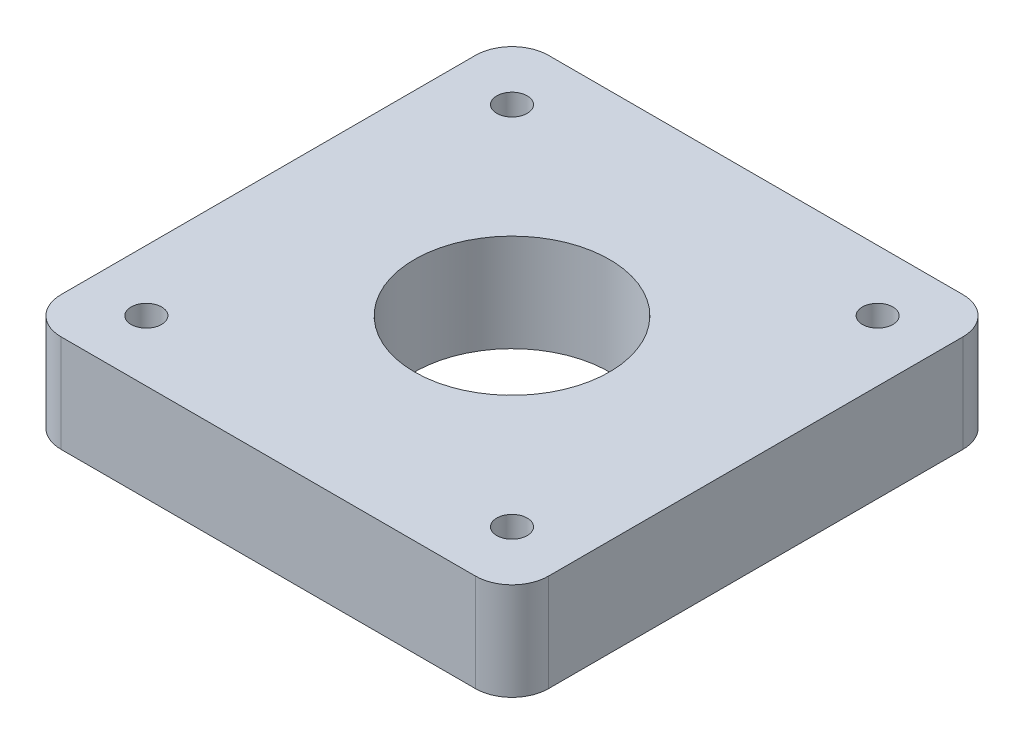
ISO-10303-21;
HEADER;
FILE_DESCRIPTION(('STEP AP214'),'2;1');
FILE_NAME('part.step','',(''),(''),'','','');
FILE_SCHEMA(('AUTOMOTIVE_DESIGN { 1 0 10303 214 1 1 1 1 }'));
ENDSEC;
DATA;
#1=APPLICATION_CONTEXT('core data for automotive mechanical design processes');
#2=APPLICATION_PROTOCOL_DEFINITION('international standard','automotive_design',2000,#1);
#3=PRODUCT_CONTEXT('',#1,'mechanical');
#4=PRODUCT('Part','Part','',(#3));
#5=PRODUCT_RELATED_PRODUCT_CATEGORY('part','',(#4));
#6=PRODUCT_DEFINITION_FORMATION('','',#4);
#7=PRODUCT_DEFINITION_CONTEXT('part definition',#1,'design');
#8=PRODUCT_DEFINITION('design','',#6,#7);
#9=PRODUCT_DEFINITION_SHAPE('','',#8);
#10=(LENGTH_UNIT() NAMED_UNIT(*) SI_UNIT(.MILLI.,.METRE.));
#11=(NAMED_UNIT(*) PLANE_ANGLE_UNIT() SI_UNIT($,.RADIAN.));
#12=(NAMED_UNIT(*) SI_UNIT($,.STERADIAN.) SOLID_ANGLE_UNIT());
#13=UNCERTAINTY_MEASURE_WITH_UNIT(LENGTH_MEASURE(1.E-05),#10,'distance_accuracy_value','');
#14=(GEOMETRIC_REPRESENTATION_CONTEXT(3) GLOBAL_UNCERTAINTY_ASSIGNED_CONTEXT((#13)) GLOBAL_UNIT_ASSIGNED_CONTEXT((#10,
#11,#12)) REPRESENTATION_CONTEXT('',''));
#15=CARTESIAN_POINT('',(0.,0.,0.));
#16=DIRECTION('',(0.,0.,1.));
#17=DIRECTION('',(1.,0.,0.));
#18=AXIS2_PLACEMENT_3D('',#15,#16,#17);
#19=CARTESIAN_POINT('',(0.,8.,0.));
#20=DIRECTION('',(0.,1.,0.));
#21=DIRECTION('',(0.,0.,1.));
#22=AXIS2_PLACEMENT_3D('',#19,#20,#21);
#23=PLANE('',#22);
#24=CARTESIAN_POINT('',(5.,8.,34.8885793871866));
#25=DIRECTION('',(0.,1.,0.));
#26=DIRECTION('',(0.,0.,1.));
#27=AXIS2_PLACEMENT_3D('',#24,#25,#26);
#28=CIRCLE('',#27,1.25);
#29=CARTESIAN_POINT('',(5.,8.,36.1385793871866));
#30=VERTEX_POINT('',#29);
#31=EDGE_CURVE('E192',#30,#30,#28,.T.);
#32=ORIENTED_EDGE('',*,*,#31,.F.);
#33=EDGE_LOOP('',(#32));
#34=FACE_BOUND('',#33,.T.);
#35=CARTESIAN_POINT('',(35.,8.,34.8885793871866));
#36=DIRECTION('',(0.,1.,0.));
#37=DIRECTION('',(0.,0.,1.));
#38=AXIS2_PLACEMENT_3D('',#35,#36,#37);
#39=CIRCLE('',#38,1.25);
#40=CARTESIAN_POINT('',(35.,8.,36.1385793871866));
#41=VERTEX_POINT('',#40);
#42=EDGE_CURVE('E198',#41,#41,#39,.T.);
#43=ORIENTED_EDGE('',*,*,#42,.F.);
#44=EDGE_LOOP('',(#43));
#45=FACE_BOUND('',#44,.T.);
#46=CARTESIAN_POINT('',(35.,8.,4.88857938718663));
#47=DIRECTION('',(0.,1.,0.));
#48=DIRECTION('',(0.,0.,1.));
#49=AXIS2_PLACEMENT_3D('',#46,#47,#48);
#50=CIRCLE('',#49,1.25);
#51=CARTESIAN_POINT('',(35.,8.,6.13857938718663));
#52=VERTEX_POINT('',#51);
#53=EDGE_CURVE('E204',#52,#52,#50,.T.);
#54=ORIENTED_EDGE('',*,*,#53,.F.);
#55=EDGE_LOOP('',(#54));
#56=FACE_BOUND('',#55,.T.);
#57=CARTESIAN_POINT('',(5.,8.,4.88857938718664));
#58=DIRECTION('',(0.,1.,0.));
#59=DIRECTION('',(0.,0.,1.));
#60=AXIS2_PLACEMENT_3D('',#57,#58,#59);
#61=CIRCLE('',#60,1.25);
#62=CARTESIAN_POINT('',(5.,8.,6.13857938718664));
#63=VERTEX_POINT('',#62);
#64=EDGE_CURVE('E186',#63,#63,#61,.T.);
#65=ORIENTED_EDGE('',*,*,#64,.F.);
#66=EDGE_LOOP('',(#65));
#67=FACE_BOUND('',#66,.T.);
#68=DIRECTION('',(1.,0.,0.));
#69=VECTOR('',#68,1.);
#70=CARTESIAN_POINT('',(0.,8.,39.8885793871866));
#71=LINE('',#70,#69);
#72=CARTESIAN_POINT('',(3.,8.,39.8885793871866));
#73=VERTEX_POINT('',#72);
#74=CARTESIAN_POINT('',(37.,8.,39.8885793871866));
#75=VERTEX_POINT('',#74);
#76=EDGE_CURVE('E170',#73,#75,#71,.T.);
#77=ORIENTED_EDGE('',*,*,#76,.T.);
#78=CARTESIAN_POINT('',(37.,8.,36.8885793871866));
#79=DIRECTION('',(0.,1.,0.));
#80=DIRECTION('',(0.,0.,1.));
#81=AXIS2_PLACEMENT_3D('',#78,#79,#80);
#82=CIRCLE('',#81,3.);
#83=CARTESIAN_POINT('',(40.,8.,36.8885793871866));
#84=VERTEX_POINT('',#83);
#85=EDGE_CURVE('E151',#75,#84,#82,.T.);
#86=ORIENTED_EDGE('',*,*,#85,.T.);
#87=DIRECTION('',(0.,0.,-1.));
#88=VECTOR('',#87,1.);
#89=CARTESIAN_POINT('',(40.,8.,-0.111420612813364));
#90=LINE('',#89,#88);
#91=CARTESIAN_POINT('',(40.,8.,2.88857938718664));
#92=VERTEX_POINT('',#91);
#93=EDGE_CURVE('E121',#84,#92,#90,.T.);
#94=ORIENTED_EDGE('',*,*,#93,.T.);
#95=CARTESIAN_POINT('',(37.,8.,2.88857938718664));
#96=DIRECTION('',(0.,1.,0.));
#97=DIRECTION('',(0.,0.,1.));
#98=AXIS2_PLACEMENT_3D('',#95,#96,#97);
#99=CIRCLE('',#98,3.);
#100=CARTESIAN_POINT('',(37.,8.,-0.111420612813364));
#101=VERTEX_POINT('',#100);
#102=EDGE_CURVE('E57',#92,#101,#99,.T.);
#103=ORIENTED_EDGE('',*,*,#102,.T.);
#104=DIRECTION('',(-1.,0.,0.));
#105=VECTOR('',#104,1.);
#106=CARTESIAN_POINT('',(0.,8.,-0.111420612813364));
#107=LINE('',#106,#105);
#108=CARTESIAN_POINT('',(3.,8.,-0.111420612813364));
#109=VERTEX_POINT('',#108);
#110=EDGE_CURVE('E137',#101,#109,#107,.T.);
#111=ORIENTED_EDGE('',*,*,#110,.T.);
#112=CARTESIAN_POINT('',(3.,8.,2.88857938718664));
#113=DIRECTION('',(0.,1.,0.));
#114=DIRECTION('',(0.,0.,1.));
#115=AXIS2_PLACEMENT_3D('',#112,#113,#114);
#116=CIRCLE('',#115,3.);
#117=CARTESIAN_POINT('',(0.,8.,2.88857938718664));
#118=VERTEX_POINT('',#117);
#119=EDGE_CURVE('E148',#109,#118,#116,.T.);
#120=ORIENTED_EDGE('',*,*,#119,.T.);
#121=DIRECTION('',(0.,0.,1.));
#122=VECTOR('',#121,1.);
#123=CARTESIAN_POINT('',(0.,8.,-0.111420612813364));
#124=LINE('',#123,#122);
#125=CARTESIAN_POINT('',(0.,8.,36.8885793871866));
#126=VERTEX_POINT('',#125);
#127=EDGE_CURVE('E131',#118,#126,#124,.T.);
#128=ORIENTED_EDGE('',*,*,#127,.T.);
#129=CARTESIAN_POINT('',(3.,8.,36.8885793871866));
#130=DIRECTION('',(0.,1.,0.));
#131=DIRECTION('',(0.,0.,1.));
#132=AXIS2_PLACEMENT_3D('',#129,#130,#131);
#133=CIRCLE('',#132,3.);
#134=EDGE_CURVE('E146',#126,#73,#133,.T.);
#135=ORIENTED_EDGE('',*,*,#134,.T.);
#136=EDGE_LOOP('',(#77,#86,#94,#103,#111,#120,#128,#135));
#137=FACE_BOUND('',#136,.T.);
#138=CARTESIAN_POINT('',(20.,8.,19.8885793871866));
#139=DIRECTION('',(0.,1.,0.));
#140=DIRECTION('',(0.,0.,1.));
#141=AXIS2_PLACEMENT_3D('',#138,#139,#140);
#142=CIRCLE('',#141,8.);
#143=CARTESIAN_POINT('',(20.,8.,27.8885793871866));
#144=VERTEX_POINT('',#143);
#145=EDGE_CURVE('E175',#144,#144,#142,.T.);
#146=ORIENTED_EDGE('',*,*,#145,.F.);
#147=EDGE_LOOP('',(#146));
#148=FACE_BOUND('',#147,.T.);
#149=ADVANCED_FACE('F35',(#34,#45,#56,#67,#137,#148),#23,.T.);
#150=CARTESIAN_POINT('',(0.,0.,0.));
#151=DIRECTION('',(0.,1.,0.));
#152=DIRECTION('',(0.,0.,1.));
#153=AXIS2_PLACEMENT_3D('',#150,#151,#152);
#154=PLANE('',#153);
#155=CARTESIAN_POINT('',(5.,0.,34.8885793871866));
#156=DIRECTION('',(0.,1.,0.));
#157=DIRECTION('',(0.,0.,1.));
#158=AXIS2_PLACEMENT_3D('',#155,#156,#157);
#159=CIRCLE('',#158,1.25);
#160=CARTESIAN_POINT('',(5.,0.,36.1385793871866));
#161=VERTEX_POINT('',#160);
#162=EDGE_CURVE('E195',#161,#161,#159,.T.);
#163=ORIENTED_EDGE('',*,*,#162,.T.);
#164=EDGE_LOOP('',(#163));
#165=FACE_BOUND('',#164,.T.);
#166=CARTESIAN_POINT('',(35.,0.,34.8885793871866));
#167=DIRECTION('',(0.,1.,0.));
#168=DIRECTION('',(0.,0.,1.));
#169=AXIS2_PLACEMENT_3D('',#166,#167,#168);
#170=CIRCLE('',#169,1.25);
#171=CARTESIAN_POINT('',(35.,0.,36.1385793871866));
#172=VERTEX_POINT('',#171);
#173=EDGE_CURVE('E201',#172,#172,#170,.T.);
#174=ORIENTED_EDGE('',*,*,#173,.T.);
#175=EDGE_LOOP('',(#174));
#176=FACE_BOUND('',#175,.T.);
#177=CARTESIAN_POINT('',(35.,0.,4.88857938718663));
#178=DIRECTION('',(0.,1.,0.));
#179=DIRECTION('',(0.,0.,1.));
#180=AXIS2_PLACEMENT_3D('',#177,#178,#179);
#181=CIRCLE('',#180,1.25);
#182=CARTESIAN_POINT('',(35.,0.,6.13857938718663));
#183=VERTEX_POINT('',#182);
#184=EDGE_CURVE('E189',#183,#183,#181,.T.);
#185=ORIENTED_EDGE('',*,*,#184,.T.);
#186=EDGE_LOOP('',(#185));
#187=FACE_BOUND('',#186,.T.);
#188=CARTESIAN_POINT('',(5.,0.,4.88857938718664));
#189=DIRECTION('',(0.,1.,0.));
#190=DIRECTION('',(0.,0.,1.));
#191=AXIS2_PLACEMENT_3D('',#188,#189,#190);
#192=CIRCLE('',#191,1.25);
#193=CARTESIAN_POINT('',(5.,0.,6.13857938718664));
#194=VERTEX_POINT('',#193);
#195=EDGE_CURVE('E184',#194,#194,#192,.T.);
#196=ORIENTED_EDGE('',*,*,#195,.T.);
#197=EDGE_LOOP('',(#196));
#198=FACE_BOUND('',#197,.T.);
#199=DIRECTION('',(0.,0.,-1.));
#200=VECTOR('',#199,1.);
#201=CARTESIAN_POINT('',(40.,0.,-0.111420612813364));
#202=LINE('',#201,#200);
#203=CARTESIAN_POINT('',(40.,0.,36.8885793871866));
#204=VERTEX_POINT('',#203);
#205=CARTESIAN_POINT('',(40.,0.,2.88857938718664));
#206=VERTEX_POINT('',#205);
#207=EDGE_CURVE('E119',#204,#206,#202,.T.);
#208=ORIENTED_EDGE('',*,*,#207,.F.);
#209=CARTESIAN_POINT('',(37.,0.,36.8885793871866));
#210=DIRECTION('',(0.,1.,0.));
#211=DIRECTION('',(0.,0.,1.));
#212=AXIS2_PLACEMENT_3D('',#209,#210,#211);
#213=CIRCLE('',#212,3.);
#214=CARTESIAN_POINT('',(37.,0.,39.8885793871866));
#215=VERTEX_POINT('',#214);
#216=EDGE_CURVE('E102',#204,#215,#213,.F.);
#217=ORIENTED_EDGE('',*,*,#216,.T.);
#218=DIRECTION('',(1.,0.,0.));
#219=VECTOR('',#218,1.);
#220=CARTESIAN_POINT('',(0.,0.,39.8885793871866));
#221=LINE('',#220,#219);
#222=CARTESIAN_POINT('',(3.,0.,39.8885793871866));
#223=VERTEX_POINT('',#222);
#224=EDGE_CURVE('E129',#223,#215,#221,.T.);
#225=ORIENTED_EDGE('',*,*,#224,.F.);
#226=CARTESIAN_POINT('',(3.,0.,36.8885793871866));
#227=DIRECTION('',(0.,1.,0.));
#228=DIRECTION('',(0.,0.,1.));
#229=AXIS2_PLACEMENT_3D('',#226,#227,#228);
#230=CIRCLE('',#229,3.);
#231=CARTESIAN_POINT('',(0.,0.,36.8885793871866));
#232=VERTEX_POINT('',#231);
#233=EDGE_CURVE('E122',#223,#232,#230,.F.);
#234=ORIENTED_EDGE('',*,*,#233,.T.);
#235=DIRECTION('',(0.,0.,1.));
#236=VECTOR('',#235,1.);
#237=CARTESIAN_POINT('',(0.,0.,-0.111420612813364));
#238=LINE('',#237,#236);
#239=CARTESIAN_POINT('',(0.,0.,2.88857938718664));
#240=VERTEX_POINT('',#239);
#241=EDGE_CURVE('E133',#240,#232,#238,.T.);
#242=ORIENTED_EDGE('',*,*,#241,.F.);
#243=CARTESIAN_POINT('',(3.,0.,2.88857938718664));
#244=DIRECTION('',(0.,1.,0.));
#245=DIRECTION('',(0.,0.,1.));
#246=AXIS2_PLACEMENT_3D('',#243,#244,#245);
#247=CIRCLE('',#246,3.);
#248=CARTESIAN_POINT('',(3.,0.,-0.111420612813364));
#249=VERTEX_POINT('',#248);
#250=EDGE_CURVE('E140',#240,#249,#247,.F.);
#251=ORIENTED_EDGE('',*,*,#250,.T.);
#252=DIRECTION('',(-1.,0.,0.));
#253=VECTOR('',#252,1.);
#254=CARTESIAN_POINT('',(0.,0.,-0.111420612813364));
#255=LINE('',#254,#253);
#256=CARTESIAN_POINT('',(37.,0.,-0.111420612813364));
#257=VERTEX_POINT('',#256);
#258=EDGE_CURVE('E128',#257,#249,#255,.T.);
#259=ORIENTED_EDGE('',*,*,#258,.F.);
#260=CARTESIAN_POINT('',(37.,0.,2.88857938718664));
#261=DIRECTION('',(0.,1.,0.));
#262=DIRECTION('',(0.,0.,1.));
#263=AXIS2_PLACEMENT_3D('',#260,#261,#262);
#264=CIRCLE('',#263,3.);
#265=EDGE_CURVE('E113',#257,#206,#264,.F.);
#266=ORIENTED_EDGE('',*,*,#265,.T.);
#267=EDGE_LOOP('',(#208,#217,#225,#234,#242,#251,#259,#266));
#268=FACE_BOUND('',#267,.T.);
#269=CARTESIAN_POINT('',(20.,0.,19.8885793871866));
#270=DIRECTION('',(0.,1.,0.));
#271=DIRECTION('',(0.,0.,1.));
#272=AXIS2_PLACEMENT_3D('',#269,#270,#271);
#273=CIRCLE('',#272,8.);
#274=CARTESIAN_POINT('',(20.,0.,27.8885793871866));
#275=VERTEX_POINT('',#274);
#276=EDGE_CURVE('E177',#275,#275,#273,.T.);
#277=ORIENTED_EDGE('',*,*,#276,.T.);
#278=EDGE_LOOP('',(#277));
#279=FACE_BOUND('',#278,.T.);
#280=ADVANCED_FACE('F125',(#165,#176,#187,#198,#268,#279),#154,.F.);
#281=CARTESIAN_POINT('',(0.,8.,-0.111420612813364));
#282=DIRECTION('',(1.,0.,0.));
#283=DIRECTION('',(0.,0.,-1.));
#284=AXIS2_PLACEMENT_3D('',#281,#282,#283);
#285=PLANE('',#284);
#286=ORIENTED_EDGE('',*,*,#127,.F.);
#287=DIRECTION('',(0.,-1.,0.));
#288=VECTOR('',#287,1.);
#289=CARTESIAN_POINT('',(0.,8.,2.88857938718664));
#290=LINE('',#289,#288);
#291=EDGE_CURVE('E11',#118,#240,#290,.T.);
#292=ORIENTED_EDGE('',*,*,#291,.T.);
#293=ORIENTED_EDGE('',*,*,#241,.T.);
#294=DIRECTION('',(0.,-1.,0.));
#295=VECTOR('',#294,1.);
#296=CARTESIAN_POINT('',(0.,8.,36.8885793871866));
#297=LINE('',#296,#295);
#298=EDGE_CURVE('E43',#232,#126,#297,.F.);
#299=ORIENTED_EDGE('',*,*,#298,.T.);
#300=EDGE_LOOP('',(#286,#292,#293,#299));
#301=FACE_BOUND('',#300,.T.);
#302=ADVANCED_FACE('F161',(#301),#285,.F.);
#303=CARTESIAN_POINT('',(0.,8.,39.8885793871866));
#304=DIRECTION('',(0.,0.,-1.));
#305=DIRECTION('',(-1.,0.,0.));
#306=AXIS2_PLACEMENT_3D('',#303,#304,#305);
#307=PLANE('',#306);
#308=ORIENTED_EDGE('',*,*,#224,.T.);
#309=DIRECTION('',(0.,-1.,0.));
#310=VECTOR('',#309,1.);
#311=CARTESIAN_POINT('',(37.,8.,39.8885793871866));
#312=LINE('',#311,#310);
#313=EDGE_CURVE('E107',#215,#75,#312,.F.);
#314=ORIENTED_EDGE('',*,*,#313,.T.);
#315=ORIENTED_EDGE('',*,*,#76,.F.);
#316=DIRECTION('',(0.,-1.,0.));
#317=VECTOR('',#316,1.);
#318=CARTESIAN_POINT('',(3.,8.,39.8885793871866));
#319=LINE('',#318,#317);
#320=EDGE_CURVE('E112',#73,#223,#319,.T.);
#321=ORIENTED_EDGE('',*,*,#320,.T.);
#322=EDGE_LOOP('',(#308,#314,#315,#321));
#323=FACE_BOUND('',#322,.T.);
#324=ADVANCED_FACE('F174',(#323),#307,.F.);
#325=CARTESIAN_POINT('',(40.,8.,-0.111420612813364));
#326=DIRECTION('',(-1.,0.,0.));
#327=DIRECTION('',(0.,0.,1.));
#328=AXIS2_PLACEMENT_3D('',#325,#326,#327);
#329=PLANE('',#328);
#330=ORIENTED_EDGE('',*,*,#93,.F.);
#331=DIRECTION('',(0.,-1.,0.));
#332=VECTOR('',#331,1.);
#333=CARTESIAN_POINT('',(40.,8.,36.8885793871866));
#334=LINE('',#333,#332);
#335=EDGE_CURVE('E106',#84,#204,#334,.T.);
#336=ORIENTED_EDGE('',*,*,#335,.T.);
#337=ORIENTED_EDGE('',*,*,#207,.T.);
#338=DIRECTION('',(0.,-1.,0.));
#339=VECTOR('',#338,1.);
#340=CARTESIAN_POINT('',(40.,8.,2.88857938718664));
#341=LINE('',#340,#339);
#342=EDGE_CURVE('E123',#206,#92,#341,.F.);
#343=ORIENTED_EDGE('',*,*,#342,.T.);
#344=EDGE_LOOP('',(#330,#336,#337,#343));
#345=FACE_BOUND('',#344,.T.);
#346=ADVANCED_FACE('F118',(#345),#329,.F.);
#347=CARTESIAN_POINT('',(0.,8.,-0.111420612813364));
#348=DIRECTION('',(0.,0.,1.));
#349=DIRECTION('',(1.,0.,0.));
#350=AXIS2_PLACEMENT_3D('',#347,#348,#349);
#351=PLANE('',#350);
#352=ORIENTED_EDGE('',*,*,#110,.F.);
#353=DIRECTION('',(0.,-1.,0.));
#354=VECTOR('',#353,1.);
#355=CARTESIAN_POINT('',(37.,8.,-0.111420612813364));
#356=LINE('',#355,#354);
#357=EDGE_CURVE('E154',#101,#257,#356,.T.);
#358=ORIENTED_EDGE('',*,*,#357,.T.);
#359=ORIENTED_EDGE('',*,*,#258,.T.);
#360=DIRECTION('',(0.,-1.,0.));
#361=VECTOR('',#360,1.);
#362=CARTESIAN_POINT('',(3.,8.,-0.111420612813364));
#363=LINE('',#362,#361);
#364=EDGE_CURVE('E50',#249,#109,#363,.F.);
#365=ORIENTED_EDGE('',*,*,#364,.T.);
#366=EDGE_LOOP('',(#352,#358,#359,#365));
#367=FACE_BOUND('',#366,.T.);
#368=ADVANCED_FACE('F233',(#367),#351,.F.);
#369=CARTESIAN_POINT('',(20.,8.,19.8885793871866));
#370=DIRECTION('',(0.,-1.,0.));
#371=DIRECTION('',(0.,0.,-1.));
#372=AXIS2_PLACEMENT_3D('',#369,#370,#371);
#373=CYLINDRICAL_SURFACE('',#372,8.);
#374=ORIENTED_EDGE('',*,*,#145,.T.);
#375=EDGE_LOOP('',(#374));
#376=FACE_BOUND('',#375,.T.);
#377=ORIENTED_EDGE('',*,*,#276,.F.);
#378=EDGE_LOOP('',(#377));
#379=FACE_BOUND('',#378,.T.);
#380=ADVANCED_FACE('F227',(#376,#379),#373,.F.);
#381=CARTESIAN_POINT('',(5.,0.,4.88857938718664));
#382=DIRECTION('',(0.,1.,0.));
#383=DIRECTION('',(0.,0.,1.));
#384=AXIS2_PLACEMENT_3D('',#381,#382,#383);
#385=CYLINDRICAL_SURFACE('',#384,1.25);
#386=ORIENTED_EDGE('',*,*,#195,.F.);
#387=EDGE_LOOP('',(#386));
#388=FACE_BOUND('',#387,.T.);
#389=ORIENTED_EDGE('',*,*,#64,.T.);
#390=EDGE_LOOP('',(#389));
#391=FACE_BOUND('',#390,.T.);
#392=ADVANCED_FACE('F216',(#388,#391),#385,.F.);
#393=CARTESIAN_POINT('',(35.,0.,4.88857938718663));
#394=DIRECTION('',(0.,1.,0.));
#395=DIRECTION('',(0.,0.,1.));
#396=AXIS2_PLACEMENT_3D('',#393,#394,#395);
#397=CYLINDRICAL_SURFACE('',#396,1.25);
#398=ORIENTED_EDGE('',*,*,#184,.F.);
#399=EDGE_LOOP('',(#398));
#400=FACE_BOUND('',#399,.T.);
#401=ORIENTED_EDGE('',*,*,#53,.T.);
#402=EDGE_LOOP('',(#401));
#403=FACE_BOUND('',#402,.T.);
#404=ADVANCED_FACE('F212',(#400,#403),#397,.F.);
#405=CARTESIAN_POINT('',(35.,0.,34.8885793871866));
#406=DIRECTION('',(0.,1.,0.));
#407=DIRECTION('',(0.,0.,1.));
#408=AXIS2_PLACEMENT_3D('',#405,#406,#407);
#409=CYLINDRICAL_SURFACE('',#408,1.25);
#410=ORIENTED_EDGE('',*,*,#173,.F.);
#411=EDGE_LOOP('',(#410));
#412=FACE_BOUND('',#411,.T.);
#413=ORIENTED_EDGE('',*,*,#42,.T.);
#414=EDGE_LOOP('',(#413));
#415=FACE_BOUND('',#414,.T.);
#416=ADVANCED_FACE('F215',(#412,#415),#409,.F.);
#417=CARTESIAN_POINT('',(5.,0.,34.8885793871866));
#418=DIRECTION('',(0.,1.,0.));
#419=DIRECTION('',(0.,0.,1.));
#420=AXIS2_PLACEMENT_3D('',#417,#418,#419);
#421=CYLINDRICAL_SURFACE('',#420,1.25);
#422=ORIENTED_EDGE('',*,*,#162,.F.);
#423=EDGE_LOOP('',(#422));
#424=FACE_BOUND('',#423,.T.);
#425=ORIENTED_EDGE('',*,*,#31,.T.);
#426=EDGE_LOOP('',(#425));
#427=FACE_BOUND('',#426,.T.);
#428=ADVANCED_FACE('F238',(#424,#427),#421,.F.);
#429=CARTESIAN_POINT('',(37.,8.,36.8885793871866));
#430=DIRECTION('',(0.,-1.,0.));
#431=DIRECTION('',(0.,0.,-1.));
#432=AXIS2_PLACEMENT_3D('',#429,#430,#431);
#433=CYLINDRICAL_SURFACE('',#432,3.);
#434=ORIENTED_EDGE('',*,*,#85,.F.);
#435=ORIENTED_EDGE('',*,*,#313,.F.);
#436=ORIENTED_EDGE('',*,*,#216,.F.);
#437=ORIENTED_EDGE('',*,*,#335,.F.);
#438=EDGE_LOOP('',(#434,#435,#436,#437));
#439=FACE_BOUND('',#438,.T.);
#440=ADVANCED_FACE('F105',(#439),#433,.T.);
#441=CARTESIAN_POINT('',(37.,8.,2.88857938718664));
#442=DIRECTION('',(0.,-1.,0.));
#443=DIRECTION('',(0.,0.,-1.));
#444=AXIS2_PLACEMENT_3D('',#441,#442,#443);
#445=CYLINDRICAL_SURFACE('',#444,3.);
#446=ORIENTED_EDGE('',*,*,#102,.F.);
#447=ORIENTED_EDGE('',*,*,#342,.F.);
#448=ORIENTED_EDGE('',*,*,#265,.F.);
#449=ORIENTED_EDGE('',*,*,#357,.F.);
#450=EDGE_LOOP('',(#446,#447,#448,#449));
#451=FACE_BOUND('',#450,.T.);
#452=ADVANCED_FACE('F254',(#451),#445,.T.);
#453=CARTESIAN_POINT('',(3.,8.,2.88857938718664));
#454=DIRECTION('',(0.,-1.,0.));
#455=DIRECTION('',(0.,0.,-1.));
#456=AXIS2_PLACEMENT_3D('',#453,#454,#455);
#457=CYLINDRICAL_SURFACE('',#456,3.);
#458=ORIENTED_EDGE('',*,*,#119,.F.);
#459=ORIENTED_EDGE('',*,*,#364,.F.);
#460=ORIENTED_EDGE('',*,*,#250,.F.);
#461=ORIENTED_EDGE('',*,*,#291,.F.);
#462=EDGE_LOOP('',(#458,#459,#460,#461));
#463=FACE_BOUND('',#462,.T.);
#464=ADVANCED_FACE('F256',(#463),#457,.T.);
#465=CARTESIAN_POINT('',(3.,8.,36.8885793871866));
#466=DIRECTION('',(0.,-1.,0.));
#467=DIRECTION('',(0.,0.,-1.));
#468=AXIS2_PLACEMENT_3D('',#465,#466,#467);
#469=CYLINDRICAL_SURFACE('',#468,3.);
#470=ORIENTED_EDGE('',*,*,#134,.F.);
#471=ORIENTED_EDGE('',*,*,#298,.F.);
#472=ORIENTED_EDGE('',*,*,#233,.F.);
#473=ORIENTED_EDGE('',*,*,#320,.F.);
#474=EDGE_LOOP('',(#470,#471,#472,#473));
#475=FACE_BOUND('',#474,.T.);
#476=ADVANCED_FACE('F37',(#475),#469,.T.);
#477=CLOSED_SHELL('',(#149,#280,#302,#324,#346,#368,#380,#392,#404,#416,#428,#440,#452,#464,#476));
#478=MANIFOLD_SOLID_BREP('B2',#477);
#479=ADVANCED_BREP_SHAPE_REPRESENTATION('',(#18,#478),#14);
#480=SHAPE_DEFINITION_REPRESENTATION(#9,#479);
ENDSEC;
END-ISO-10303-21;
